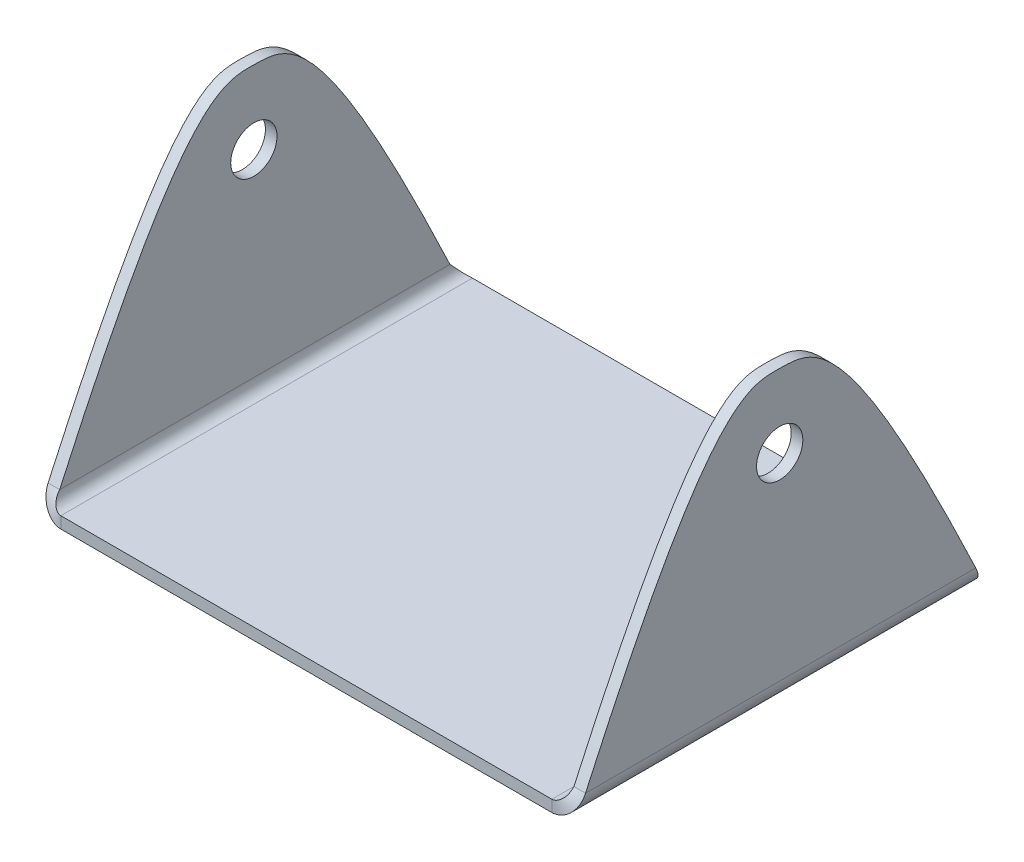
ISO-10303-21;
HEADER;
FILE_DESCRIPTION(('STEP AP214'),'2;1');
FILE_NAME('part.step','',(''),(''),'','','');
FILE_SCHEMA(('AUTOMOTIVE_DESIGN { 1 0 10303 214 1 1 1 1 }'));
ENDSEC;
DATA;
#1=APPLICATION_CONTEXT('core data for automotive mechanical design processes');
#2=APPLICATION_PROTOCOL_DEFINITION('international standard','automotive_design',2000,#1);
#3=PRODUCT_CONTEXT('',#1,'mechanical');
#4=PRODUCT('Part','Part','',(#3));
#5=PRODUCT_RELATED_PRODUCT_CATEGORY('part','',(#4));
#6=PRODUCT_DEFINITION_FORMATION('','',#4);
#7=PRODUCT_DEFINITION_CONTEXT('part definition',#1,'design');
#8=PRODUCT_DEFINITION('design','',#6,#7);
#9=PRODUCT_DEFINITION_SHAPE('','',#8);
#10=(LENGTH_UNIT() NAMED_UNIT(*) SI_UNIT(.MILLI.,.METRE.));
#11=(NAMED_UNIT(*) PLANE_ANGLE_UNIT() SI_UNIT($,.RADIAN.));
#12=(NAMED_UNIT(*) SI_UNIT($,.STERADIAN.) SOLID_ANGLE_UNIT());
#13=UNCERTAINTY_MEASURE_WITH_UNIT(LENGTH_MEASURE(1.E-05),#10,'distance_accuracy_value','');
#14=(GEOMETRIC_REPRESENTATION_CONTEXT(3) GLOBAL_UNCERTAINTY_ASSIGNED_CONTEXT((#13)) GLOBAL_UNIT_ASSIGNED_CONTEXT((#10,
#11,#12)) REPRESENTATION_CONTEXT('',''));
#15=CARTESIAN_POINT('',(0.,0.,0.));
#16=DIRECTION('',(0.,0.,1.));
#17=DIRECTION('',(1.,0.,0.));
#18=AXIS2_PLACEMENT_3D('',#15,#16,#17);
#19=CARTESIAN_POINT('',(53.3958814357847,-1.32135485592361,-40.9040584229734));
#20=DIRECTION('',(0.,0.,-1.));
#21=DIRECTION('',(-1.,0.,0.));
#22=AXIS2_PLACEMENT_3D('',#19,#20,#21);
#23=PLANE('',#22);
#24=CARTESIAN_POINT('',(-4.36467848101533,-0.0213548143236099,-40.9040584229734));
#25=CARTESIAN_POINT('',(-4.36467848101533,-1.32135485592361,-40.9040584229734));
#26=B_SPLINE_CURVE_WITH_KNOTS('',1,(#24,#25),.UNSPECIFIED.,.F.,.F.,(2,2),(0.,1.),.UNSPECIFIED.);
#27=CARTESIAN_POINT('',(-4.36467848101533,-0.0213548143236099,-40.9040584229734));
#28=VERTEX_POINT('',#27);
#29=CARTESIAN_POINT('',(-4.36467848101533,-1.32135485592361,-40.9040584229734));
#30=VERTEX_POINT('',#29);
#31=EDGE_CURVE('E11',#28,#30,#26,.T.);
#32=ORIENTED_EDGE('',*,*,#31,.F.);
#33=DIRECTION('',(1.,0.,0.));
#34=VECTOR('',#33,1.);
#35=CARTESIAN_POINT('',(53.3958814357847,-0.0213548143236099,-40.9040584229734));
#36=LINE('',#35,#34);
#37=CARTESIAN_POINT('',(50.7958813525847,-0.0213548143236099,-40.9040584229734));
#38=VERTEX_POINT('',#37);
#39=EDGE_CURVE('E89',#38,#28,#36,.F.);
#40=ORIENTED_EDGE('',*,*,#39,.F.);
#41=CARTESIAN_POINT('',(50.7958813525847,-1.32135485592361,-40.9040584229734));
#42=CARTESIAN_POINT('',(50.7958813525847,-0.0213548143236083,-40.9040584229734));
#43=B_SPLINE_CURVE_WITH_KNOTS('',1,(#41,#42),.UNSPECIFIED.,.F.,.F.,(2,2),(0.,1.),.UNSPECIFIED.);
#44=CARTESIAN_POINT('',(50.7958813525847,-1.32135485592361,-40.9040584229734));
#45=VERTEX_POINT('',#44);
#46=EDGE_CURVE('E52',#38,#45,#43,.F.);
#47=ORIENTED_EDGE('',*,*,#46,.T.);
#48=DIRECTION('',(-1.,0.,0.));
#49=VECTOR('',#48,1.);
#50=CARTESIAN_POINT('',(53.3958814357847,-1.32135485592361,-40.9040584229734));
#51=LINE('',#50,#49);
#52=EDGE_CURVE('E90',#45,#30,#51,.T.);
#53=ORIENTED_EDGE('',*,*,#52,.T.);
#54=EDGE_LOOP('',(#32,#40,#47,#53));
#55=FACE_BOUND('',#54,.T.);
#56=ADVANCED_FACE('F41',(#55),#23,.T.);
#57=CARTESIAN_POINT('',(53.3958814357847,1.27864522727639,-39.6815680245585));
#58=CARTESIAN_POINT('',(53.3958814357847,0.987146737130774,-39.819573695673));
#59=CARTESIAN_POINT('',(53.3447870874558,0.665094926466159,-39.9652311101939));
#60=CARTESIAN_POINT('',(53.1044211189325,0.0360638158292626,-40.2462624188304));
#61=CARTESIAN_POINT('',(52.914750798196,-0.269809987593072,-40.3818022656543));
#62=CARTESIAN_POINT('',(52.4192520192248,-0.783389922446821,-40.6183390533466));
#63=CARTESIAN_POINT('',(52.1143988455855,-0.989740400718229,-40.7193359942148));
#64=CARTESIAN_POINT('',(51.4633526800292,-1.25878334584269,-40.8621956790282));
#65=CARTESIAN_POINT('',(51.1185354711386,-1.32135485592361,-40.9040584229734));
#66=CARTESIAN_POINT('',(50.7958813525847,-1.32135485592361,-40.9040584229734));
#67=CARTESIAN_POINT('',(52.0958813941847,1.27864522727639,-39.6815680245585));
#68=CARTESIAN_POINT('',(52.0958813941847,1.1328338425608,-39.8196325338721));
#69=CARTESIAN_POINT('',(52.0703342200202,0.971870076871275,-39.9652311101939));
#70=CARTESIAN_POINT('',(51.9501512357586,0.657354521552827,-40.2462624188304));
#71=CARTESIAN_POINT('',(51.8553160753903,0.504417619841661,-40.3818022656543));
#72=CARTESIAN_POINT('',(51.6075666859047,0.247627652414786,-40.6183390533466));
#73=CARTESIAN_POINT('',(51.4551400990851,0.144452413279082,-40.7193359942148));
#74=CARTESIAN_POINT('',(51.1296170163069,0.00993094071684946,-40.8621956790282));
#75=CARTESIAN_POINT('',(50.9572084118616,-0.0213548143236083,-40.9040584229734));
#76=CARTESIAN_POINT('',(50.7958813525847,-0.0213548143236083,-40.9040584229734));
#77=B_SPLINE_SURFACE_WITH_KNOTS('',1,3,((#57,#58,#59,#60,#61,#62,#63,#64,#65,#66),(#67,#68,#69,
#70,#71,#72,#73,#74,#75,#76)),.UNSPECIFIED.,.F.,.F.,.F.,(2,2),(4,2,2,2,4),(0.,1.),(0.,0.25,0.5,
0.75,1.),.UNSPECIFIED.);
#78=CARTESIAN_POINT('',(50.7958813525847,-0.0213548143236083,-40.9040584229734));
#79=CARTESIAN_POINT('',(50.9572084118616,-0.0213548143236083,-40.9040584229734));
#80=CARTESIAN_POINT('',(51.1296170163069,0.00993094071684946,-40.8621956790282));
#81=CARTESIAN_POINT('',(51.4551400990851,0.144452413279082,-40.7193359942148));
#82=CARTESIAN_POINT('',(51.6075666859047,0.247627652414786,-40.6183390533466));
#83=CARTESIAN_POINT('',(51.8553160753903,0.504417619841661,-40.3818022656543));
#84=CARTESIAN_POINT('',(51.9501512357586,0.657354521552827,-40.2462624188304));
#85=CARTESIAN_POINT('',(52.0703342200202,0.971870076871275,-39.9652311101939));
#86=CARTESIAN_POINT('',(52.0958813941847,1.1328338425608,-39.8196325338721));
#87=CARTESIAN_POINT('',(52.0958813941847,1.27864522727639,-39.6815680245585));
#88=B_SPLINE_CURVE_WITH_KNOTS('',3,(#78,#79,#80,#81,#82,#83,#84,#85,#86,#87),.UNSPECIFIED.,.F.,
.F.,(4,2,2,2,4),(0.,0.25,0.5,0.75,1.),.UNSPECIFIED.);
#89=CARTESIAN_POINT('',(52.0958813941847,1.27864522729145,-39.6815680245585));
#90=VERTEX_POINT('',#89);
#91=EDGE_CURVE('E257',#38,#90,#88,.T.);
#92=CARTESIAN_POINT('',(52.0958813941847,1.27864522727639,-39.6815680245585));
#93=CARTESIAN_POINT('',(53.3958814357847,1.27864522727639,-39.6815680245585));
#94=B_SPLINE_CURVE_WITH_KNOTS('',1,(#92,#93),.UNSPECIFIED.,.F.,.F.,(2,2),(0.,1.),.UNSPECIFIED.);
#95=CARTESIAN_POINT('',(53.3958814357847,1.27864522730651,-39.6815680245585));
#96=VERTEX_POINT('',#95);
#97=EDGE_CURVE('E226',#90,#96,#94,.T.);
#98=CARTESIAN_POINT('',(53.3958814357847,1.27864522727639,-39.6815680245585));
#99=CARTESIAN_POINT('',(53.3958814357847,0.987146737130774,-39.819573695673));
#100=CARTESIAN_POINT('',(53.3447870874558,0.665094926466159,-39.9652311101939));
#101=CARTESIAN_POINT('',(53.1044211189325,0.0360638158292626,-40.2462624188304));
#102=CARTESIAN_POINT('',(52.914750798196,-0.269809987593072,-40.3818022656543));
#103=CARTESIAN_POINT('',(52.4192520192248,-0.783389922446821,-40.6183390533466));
#104=CARTESIAN_POINT('',(52.1143988455855,-0.989740400718229,-40.7193359942148));
#105=CARTESIAN_POINT('',(51.4633526800292,-1.25878334584269,-40.8621956790282));
#106=CARTESIAN_POINT('',(51.1185354711386,-1.32135485592361,-40.9040584229734));
#107=CARTESIAN_POINT('',(50.7958813525847,-1.32135485592361,-40.9040584229734));
#108=B_SPLINE_CURVE_WITH_KNOTS('',3,(#98,#99,#100,#101,#102,#103,#104,#105,#106,#107),
.UNSPECIFIED.,.F.,.F.,(4,2,2,2,4),(0.,0.25,0.5,0.75,1.),.UNSPECIFIED.);
#109=EDGE_CURVE('E354',#45,#96,#108,.F.);
#110=ORIENTED_EDGE('',*,*,#46,.F.);
#111=ORIENTED_EDGE('',*,*,#91,.T.);
#112=ORIENTED_EDGE('',*,*,#97,.T.);
#113=ORIENTED_EDGE('',*,*,#109,.F.);
#114=EDGE_LOOP('',(#110,#111,#112,#113));
#115=FACE_BOUND('',#114,.T.);
#116=ADVANCED_FACE('F177',(#115),#77,.F.);
#117=CARTESIAN_POINT('',(53.3958814357847,-1.32135485592361,-40.9040584229734));
#118=CARTESIAN_POINT('',(53.3958814357847,31.8180371755304,-25.4250310798318));
#119=CARTESIAN_POINT('',(53.3958814357847,31.4041925867274,-18.1591387318149));
#120=CARTESIAN_POINT('',(53.3958814357847,32.1638350835329,-9.61260666601467));
#121=CARTESIAN_POINT('',(53.3958814357847,-1.32135485592361,5.32394157702663));
#122=B_SPLINE_CURVE_WITH_KNOTS('',3,(#117,#118,#119,#120,#121),.UNSPECIFIED.,.F.,.F.,(4,1,4),
(0.,0.503093018915711,1.),.UNSPECIFIED.);
#123=DIRECTION('',(-1.,0.,0.));
#124=VECTOR('',#123,1.);
#125=SURFACE_OF_LINEAR_EXTRUSION('',#122,#124);
#126=ORIENTED_EDGE('',*,*,#97,.F.);
#127=CARTESIAN_POINT('',(52.0958813941847,-1.32135485592361,-40.9040584229734));
#128=CARTESIAN_POINT('',(52.0958813941847,31.8180371755304,-25.4250310798318));
#129=CARTESIAN_POINT('',(52.0958813941847,31.4041925867274,-18.1591387318149));
#130=CARTESIAN_POINT('',(52.0958813941847,32.1638350835329,-9.61260666601467));
#131=CARTESIAN_POINT('',(52.0958813941847,-1.32135485592361,5.32394157702663));
#132=B_SPLINE_CURVE_WITH_KNOTS('',3,(#127,#128,#129,#130,#131),.UNSPECIFIED.,.F.,.F.,(4,1,4),
(0.,0.503093018915711,1.),.UNSPECIFIED.);
#133=CARTESIAN_POINT('',(52.0958813941847,1.27864522730694,4.15490016711601));
#134=VERTEX_POINT('',#133);
#135=EDGE_CURVE('E124',#90,#134,#132,.T.);
#136=ORIENTED_EDGE('',*,*,#135,.T.);
#137=CARTESIAN_POINT('',(52.0958813941846,1.27864522773038,4.15490016692404));
#138=DIRECTION('',(1.,9.70027312665172E-12,-4.39752387088034E-12));
#139=VECTOR('',#138,1.);
#140=LINE('',#137,#139);
#141=CARTESIAN_POINT('',(53.3958814357847,1.27864522730695,4.15490016711601));
#142=VERTEX_POINT('',#141);
#143=EDGE_CURVE('E251',#134,#142,#140,.T.);
#144=ORIENTED_EDGE('',*,*,#143,.T.);
#145=EDGE_CURVE('E246',#96,#142,#122,.T.);
#146=ORIENTED_EDGE('',*,*,#145,.F.);
#147=EDGE_LOOP('',(#126,#136,#144,#146));
#148=FACE_BOUND('',#147,.T.);
#149=ADVANCED_FACE('F188',(#148),#125,.F.);
#150=CARTESIAN_POINT('',(50.7958813525847,-1.32135485592361,5.32394157702663));
#151=CARTESIAN_POINT('',(51.1171476947658,-1.32135485592361,5.32394157702663));
#152=CARTESIAN_POINT('',(51.4610654455445,-1.2593052369648,5.28406681350772));
#153=CARTESIAN_POINT('',(52.1113602547343,-0.99141593808192,5.14784736065074));
#154=CARTESIAN_POINT('',(52.416367930462,-0.785674000139332,5.05150267131267));
#155=CARTESIAN_POINT('',(52.9127024729477,-0.272631332897155,4.82562296803602));
#156=CARTESIAN_POINT('',(53.1030319480315,0.0333197108689155,4.69608795409745));
#157=CARTESIAN_POINT('',(53.3444297174844,0.663274815529807,4.42710720283845));
#158=CARTESIAN_POINT('',(53.3958814357847,0.986160263262902,4.28750147651959));
#159=CARTESIAN_POINT('',(53.3958814357847,1.27864522727639,4.15490016711601));
#160=CARTESIAN_POINT('',(50.7958813525847,-0.0213548143236083,5.32394157702663));
#161=CARTESIAN_POINT('',(50.9565145236752,-0.0213548143236083,5.32394157702663));
#162=CARTESIAN_POINT('',(51.1284733990646,0.0096699951557975,5.28406681350772));
#163=CARTESIAN_POINT('',(51.4536208036595,0.143614644597236,5.14784736065074));
#164=CARTESIAN_POINT('',(51.6061246415233,0.246485613568529,5.05150267131267));
#165=CARTESIAN_POINT('',(51.8542919127662,0.503006947189618,4.82562296803602));
#166=CARTESIAN_POINT('',(51.9494566503081,0.655982469072653,4.69608795409745));
#167=CARTESIAN_POINT('',(52.0701555350345,0.9709600214031,4.42710720283845));
#168=CARTESIAN_POINT('',(52.0958813941847,1.1323430358755,4.2875556163546));
#169=CARTESIAN_POINT('',(52.0958813941847,1.27864522727639,4.15490016711601));
#170=B_SPLINE_SURFACE_WITH_KNOTS('',1,3,((#150,#151,#152,#153,#154,#155,#156,#157,#158,#159),
(#160,#161,#162,#163,#164,#165,#166,#167,#168,#169)),.UNSPECIFIED.,.F.,.F.,.F.,(2,2),(4,2,2,2,
4),(0.,1.),(0.,0.25,0.5,0.75,1.),.UNSPECIFIED.);
#171=CARTESIAN_POINT('',(52.0958813941847,1.27864522727639,4.15490016711601));
#172=CARTESIAN_POINT('',(52.0958813941847,1.1323430358755,4.2875556163546));
#173=CARTESIAN_POINT('',(52.0701555350345,0.9709600214031,4.42710720283845));
#174=CARTESIAN_POINT('',(51.9494566503081,0.655982469072653,4.69608795409745));
#175=CARTESIAN_POINT('',(51.8542919127662,0.503006947189618,4.82562296803602));
#176=CARTESIAN_POINT('',(51.6061246415233,0.246485613568529,5.05150267131267));
#177=CARTESIAN_POINT('',(51.4536208036595,0.143614644597236,5.14784736065074));
#178=CARTESIAN_POINT('',(51.1284733990646,0.0096699951557975,5.28406681350772));
#179=CARTESIAN_POINT('',(50.9565145236752,-0.0213548143236083,5.32394157702663));
#180=CARTESIAN_POINT('',(50.7958813525847,-0.0213548143236083,5.32394157702663));
#181=B_SPLINE_CURVE_WITH_KNOTS('',3,(#171,#172,#173,#174,#175,#176,#177,#178,#179,#180),
.UNSPECIFIED.,.F.,.F.,(4,2,2,2,4),(0.,0.25,0.5,0.75,1.),.UNSPECIFIED.);
#182=CARTESIAN_POINT('',(50.7958813525847,-0.0213548143236083,5.32394157702663));
#183=VERTEX_POINT('',#182);
#184=EDGE_CURVE('E132',#134,#183,#181,.T.);
#185=CARTESIAN_POINT('',(50.7958813525847,-0.0213548143236083,5.32394157702663));
#186=CARTESIAN_POINT('',(50.7958813525847,-1.32135485592361,5.32394157702663));
#187=B_SPLINE_CURVE_WITH_KNOTS('',1,(#185,#186),.UNSPECIFIED.,.F.,.F.,(2,2),(0.,1.),.UNSPECIFIED.);
#188=CARTESIAN_POINT('',(50.7958813525847,-1.32135485592361,5.32394157702663));
#189=VERTEX_POINT('',#188);
#190=EDGE_CURVE('E270',#183,#189,#187,.T.);
#191=CARTESIAN_POINT('',(50.7958813525847,-1.32135485592361,5.32394157702663));
#192=CARTESIAN_POINT('',(51.1171476947658,-1.32135485592361,5.32394157702663));
#193=CARTESIAN_POINT('',(51.4610654455445,-1.2593052369648,5.28406681350772));
#194=CARTESIAN_POINT('',(52.1113602547343,-0.99141593808192,5.14784736065074));
#195=CARTESIAN_POINT('',(52.416367930462,-0.785674000139332,5.05150267131267));
#196=CARTESIAN_POINT('',(52.9127024729477,-0.272631332897155,4.82562296803602));
#197=CARTESIAN_POINT('',(53.1030319480315,0.0333197108689155,4.69608795409745));
#198=CARTESIAN_POINT('',(53.3444297174844,0.663274815529807,4.42710720283845));
#199=CARTESIAN_POINT('',(53.3958814357847,0.986160263262902,4.28750147651959));
#200=CARTESIAN_POINT('',(53.3958814357847,1.27864522727639,4.15490016711601));
#201=B_SPLINE_CURVE_WITH_KNOTS('',3,(#191,#192,#193,#194,#195,#196,#197,#198,#199,#200),
.UNSPECIFIED.,.F.,.F.,(4,2,2,2,4),(0.,0.25,0.5,0.75,1.),.UNSPECIFIED.);
#202=EDGE_CURVE('E349',#142,#189,#201,.F.);
#203=ORIENTED_EDGE('',*,*,#143,.F.);
#204=ORIENTED_EDGE('',*,*,#184,.T.);
#205=ORIENTED_EDGE('',*,*,#190,.T.);
#206=ORIENTED_EDGE('',*,*,#202,.F.);
#207=EDGE_LOOP('',(#203,#204,#205,#206));
#208=FACE_BOUND('',#207,.T.);
#209=ADVANCED_FACE('F268',(#208),#170,.F.);
#210=CARTESIAN_POINT('',(53.3958814357847,-1.32135485592361,5.32394157702663));
#211=DIRECTION('',(0.,0.,-1.));
#212=DIRECTION('',(-1.,0.,0.));
#213=AXIS2_PLACEMENT_3D('',#210,#211,#212);
#214=PLANE('',#213);
#215=ORIENTED_EDGE('',*,*,#190,.F.);
#216=DIRECTION('',(1.,0.,0.));
#217=VECTOR('',#216,1.);
#218=CARTESIAN_POINT('',(53.3958814357847,-0.0213548143236099,5.32394157702663));
#219=LINE('',#218,#217);
#220=CARTESIAN_POINT('',(-4.36467848101533,-0.0213548143236099,5.32394157702663));
#221=VERTEX_POINT('',#220);
#222=EDGE_CURVE('E123',#183,#221,#219,.F.);
#223=ORIENTED_EDGE('',*,*,#222,.T.);
#224=CARTESIAN_POINT('',(-4.36467848101533,-1.32135485592361,5.32394157702663));
#225=CARTESIAN_POINT('',(-4.36467848101533,-0.0213548143236099,5.32394157702663));
#226=B_SPLINE_CURVE_WITH_KNOTS('',1,(#224,#225),.UNSPECIFIED.,.F.,.F.,(2,2),(0.,1.),.UNSPECIFIED.);
#227=CARTESIAN_POINT('',(-4.36467848101533,-1.32135485592361,5.32394157702663));
#228=VERTEX_POINT('',#227);
#229=EDGE_CURVE('E492',#221,#228,#226,.F.);
#230=ORIENTED_EDGE('',*,*,#229,.T.);
#231=DIRECTION('',(-1.,0.,0.));
#232=VECTOR('',#231,1.);
#233=CARTESIAN_POINT('',(53.3958814357847,-1.32135485592361,5.32394157702663));
#234=LINE('',#233,#232);
#235=EDGE_CURVE('E403',#189,#228,#234,.T.);
#236=ORIENTED_EDGE('',*,*,#235,.F.);
#237=EDGE_LOOP('',(#215,#223,#230,#236));
#238=FACE_BOUND('',#237,.T.);
#239=ADVANCED_FACE('F296',(#238),#214,.F.);
#240=CARTESIAN_POINT('',(-6.96467856421533,1.27864522727639,4.15490016711601));
#241=CARTESIAN_POINT('',(-6.96467856421533,0.9861602632629,4.28750147651959));
#242=CARTESIAN_POINT('',(-6.91322684591506,0.663274815529806,4.42710720283845));
#243=CARTESIAN_POINT('',(-6.67182907646217,0.0333197108689138,4.69608795409745));
#244=CARTESIAN_POINT('',(-6.48149960137836,-0.272631332897155,4.82562296803602));
#245=CARTESIAN_POINT('',(-5.98516505889267,-0.785674000139334,5.05150267131267));
#246=CARTESIAN_POINT('',(-5.68015738316499,-0.99141593808192,5.14784736065074));
#247=CARTESIAN_POINT('',(-5.02986257397513,-1.2593052369648,5.28406681350772));
#248=CARTESIAN_POINT('',(-4.68594482319644,-1.32135485592361,5.32394157702663));
#249=CARTESIAN_POINT('',(-4.36467848101533,-1.32135485592361,5.32394157702663));
#250=CARTESIAN_POINT('',(-5.66467852261533,1.27864522727639,4.15490016711601));
#251=CARTESIAN_POINT('',(-5.66467852261533,1.1323430358755,4.2875556163546));
#252=CARTESIAN_POINT('',(-5.6389526634652,0.970960021403098,4.42710720283845));
#253=CARTESIAN_POINT('',(-5.51825377873875,0.655982469072652,4.69608795409745));
#254=CARTESIAN_POINT('',(-5.42308904119684,0.503006947189618,4.82562296803602));
#255=CARTESIAN_POINT('',(-5.174921769954,0.246485613568528,5.05150267131267));
#256=CARTESIAN_POINT('',(-5.02241793209016,0.143614644597235,5.14784736065074));
#257=CARTESIAN_POINT('',(-4.69727052749523,0.00966999515579637,5.28406681350772));
#258=CARTESIAN_POINT('',(-4.52531165210588,-0.0213548143236099,5.32394157702663));
#259=CARTESIAN_POINT('',(-4.36467848101533,-0.0213548143236099,5.32394157702663));
#260=B_SPLINE_SURFACE_WITH_KNOTS('',1,3,((#240,#241,#242,#243,#244,#245,#246,#247,#248,#249),
(#250,#251,#252,#253,#254,#255,#256,#257,#258,#259)),.UNSPECIFIED.,.F.,.F.,.F.,(2,2),(4,2,2,2,
4),(0.,1.),(0.,0.25,0.5,0.75,1.),.UNSPECIFIED.);
#261=CARTESIAN_POINT('',(-4.36467848101533,-0.0213548143236099,5.32394157702663));
#262=CARTESIAN_POINT('',(-4.52531165210588,-0.0213548143236099,5.32394157702663));
#263=CARTESIAN_POINT('',(-4.69727052749523,0.00966999515579637,5.28406681350772));
#264=CARTESIAN_POINT('',(-5.02241793209016,0.143614644597235,5.14784736065074));
#265=CARTESIAN_POINT('',(-5.174921769954,0.246485613568528,5.05150267131267));
#266=CARTESIAN_POINT('',(-5.42308904119684,0.503006947189618,4.82562296803602));
#267=CARTESIAN_POINT('',(-5.51825377873875,0.655982469072652,4.69608795409745));
#268=CARTESIAN_POINT('',(-5.6389526634652,0.970960021403098,4.42710720283845));
#269=CARTESIAN_POINT('',(-5.66467852261533,1.1323430358755,4.2875556163546));
#270=CARTESIAN_POINT('',(-5.66467852261533,1.27864522727639,4.15490016711601));
#271=B_SPLINE_CURVE_WITH_KNOTS('',3,(#261,#262,#263,#264,#265,#266,#267,#268,#269,#270),
.UNSPECIFIED.,.F.,.F.,(4,2,2,2,4),(0.,0.25,0.5,0.75,1.),.UNSPECIFIED.);
#272=CARTESIAN_POINT('',(-5.66467852261533,1.27864522729167,4.15490016711601));
#273=VERTEX_POINT('',#272);
#274=EDGE_CURVE('E110',#221,#273,#271,.T.);
#275=CARTESIAN_POINT('',(-5.66467852261533,1.27864522727639,4.15490016711601));
#276=CARTESIAN_POINT('',(-6.96467856421533,1.27864522727639,4.15490016711601));
#277=B_SPLINE_CURVE_WITH_KNOTS('',1,(#275,#276),.UNSPECIFIED.,.F.,.F.,(2,2),(0.,1.),.UNSPECIFIED.);
#278=CARTESIAN_POINT('',(-6.96467856421533,1.27864522730695,4.15490016711601));
#279=VERTEX_POINT('',#278);
#280=EDGE_CURVE('E481',#273,#279,#277,.T.);
#281=CARTESIAN_POINT('',(-6.96467856421533,1.27864522727639,4.15490016711601));
#282=CARTESIAN_POINT('',(-6.96467856421533,0.9861602632629,4.28750147651959));
#283=CARTESIAN_POINT('',(-6.91322684591506,0.663274815529806,4.42710720283845));
#284=CARTESIAN_POINT('',(-6.67182907646217,0.0333197108689138,4.69608795409745));
#285=CARTESIAN_POINT('',(-6.48149960137836,-0.272631332897155,4.82562296803602));
#286=CARTESIAN_POINT('',(-5.98516505889267,-0.785674000139334,5.05150267131267));
#287=CARTESIAN_POINT('',(-5.68015738316499,-0.99141593808192,5.14784736065074));
#288=CARTESIAN_POINT('',(-5.02986257397513,-1.2593052369648,5.28406681350772));
#289=CARTESIAN_POINT('',(-4.68594482319644,-1.32135485592361,5.32394157702663));
#290=CARTESIAN_POINT('',(-4.36467848101533,-1.32135485592361,5.32394157702663));
#291=B_SPLINE_CURVE_WITH_KNOTS('',3,(#281,#282,#283,#284,#285,#286,#287,#288,#289,#290),
.UNSPECIFIED.,.F.,.F.,(4,2,2,2,4),(0.,0.25,0.5,0.75,1.),.UNSPECIFIED.);
#292=EDGE_CURVE('E439',#228,#279,#291,.F.);
#293=ORIENTED_EDGE('',*,*,#229,.F.);
#294=ORIENTED_EDGE('',*,*,#274,.T.);
#295=ORIENTED_EDGE('',*,*,#280,.T.);
#296=ORIENTED_EDGE('',*,*,#292,.F.);
#297=EDGE_LOOP('',(#293,#294,#295,#296));
#298=FACE_BOUND('',#297,.T.);
#299=ADVANCED_FACE('F444',(#298),#260,.F.);
#300=CARTESIAN_POINT('',(-6.96467856421533,-1.32135485592361,-40.9040584229734));
#301=CARTESIAN_POINT('',(-6.96467856421533,31.8180371755304,-25.4250310798318));
#302=CARTESIAN_POINT('',(-6.96467856421533,31.4041925867274,-18.1591387318149));
#303=CARTESIAN_POINT('',(-6.96467856421533,32.1638350835329,-9.61260666601467));
#304=CARTESIAN_POINT('',(-6.96467856421533,-1.32135485592361,5.32394157702663));
#305=B_SPLINE_CURVE_WITH_KNOTS('',3,(#300,#301,#302,#303,#304),.UNSPECIFIED.,.F.,.F.,(4,1,4),
(0.,0.503093018915711,1.),.UNSPECIFIED.);
#306=DIRECTION('',(-1.,0.,0.));
#307=VECTOR('',#306,1.);
#308=SURFACE_OF_LINEAR_EXTRUSION('',#305,#307);
#309=ORIENTED_EDGE('',*,*,#280,.F.);
#310=CARTESIAN_POINT('',(-5.66467852261533,-1.32135485592361,-40.9040584229734));
#311=CARTESIAN_POINT('',(-5.66467852261533,31.8180371755304,-25.4250310798318));
#312=CARTESIAN_POINT('',(-5.66467852261533,31.4041925867274,-18.1591387318149));
#313=CARTESIAN_POINT('',(-5.66467852261533,32.1638350835329,-9.61260666601467));
#314=CARTESIAN_POINT('',(-5.66467852261533,-1.32135485592361,5.32394157702663));
#315=B_SPLINE_CURVE_WITH_KNOTS('',3,(#310,#311,#312,#313,#314),.UNSPECIFIED.,.F.,.F.,(4,1,4),
(0.,0.503093018915711,1.),.UNSPECIFIED.);
#316=CARTESIAN_POINT('',(-5.66467852261533,1.27864522730651,-39.6815680245585));
#317=VERTEX_POINT('',#316);
#318=EDGE_CURVE('E116',#317,#273,#315,.T.);
#319=ORIENTED_EDGE('',*,*,#318,.F.);
#320=CARTESIAN_POINT('',(-5.66467852261533,1.27864522782091,-39.681568024315));
#321=DIRECTION('',(-1.,9.46291625864016E-12,4.49426806163718E-12));
#322=VECTOR('',#321,1.);
#323=LINE('',#320,#322);
#324=CARTESIAN_POINT('',(-6.96467856421533,1.27864522730651,-39.6815680245585));
#325=VERTEX_POINT('',#324);
#326=EDGE_CURVE('E130',#317,#325,#323,.T.);
#327=ORIENTED_EDGE('',*,*,#326,.T.);
#328=EDGE_CURVE('E411',#325,#279,#305,.T.);
#329=ORIENTED_EDGE('',*,*,#328,.T.);
#330=EDGE_LOOP('',(#309,#319,#327,#329));
#331=FACE_BOUND('',#330,.T.);
#332=ADVANCED_FACE('F455',(#331),#308,.F.);
#333=CARTESIAN_POINT('',(53.3958814357847,23.4567679524764,-17.6583100864655));
#334=DIRECTION('',(-1.,0.,0.));
#335=DIRECTION('',(0.,0.,1.));
#336=AXIS2_PLACEMENT_3D('',#333,#334,#335);
#337=CYLINDRICAL_SURFACE('',#336,2.6);
#338=CARTESIAN_POINT('',(53.3958814357847,23.4567679524764,-17.6583100864655));
#339=DIRECTION('',(1.,0.,0.));
#340=DIRECTION('',(0.,0.,-1.));
#341=AXIS2_PLACEMENT_3D('',#338,#339,#340);
#342=CIRCLE('',#341,2.6);
#343=CARTESIAN_POINT('',(53.3958814357847,23.4567679524764,-20.2583100864655));
#344=VERTEX_POINT('',#343);
#345=EDGE_CURVE('E347',#344,#344,#342,.T.);
#346=ORIENTED_EDGE('',*,*,#345,.T.);
#347=EDGE_LOOP('',(#346));
#348=FACE_BOUND('',#347,.T.);
#349=CARTESIAN_POINT('',(52.0958813941847,23.4567679524764,-17.6583100864655));
#350=DIRECTION('',(1.,0.,0.));
#351=DIRECTION('',(0.,0.,-1.));
#352=AXIS2_PLACEMENT_3D('',#349,#350,#351);
#353=CIRCLE('',#352,2.6);
#354=CARTESIAN_POINT('',(52.0958813941847,23.4567679524764,-20.2583100864655));
#355=VERTEX_POINT('',#354);
#356=EDGE_CURVE('E264',#355,#355,#353,.T.);
#357=ORIENTED_EDGE('',*,*,#356,.F.);
#358=EDGE_LOOP('',(#357));
#359=FACE_BOUND('',#358,.T.);
#360=ADVANCED_FACE('F43',(#348,#359),#337,.F.);
#361=CARTESIAN_POINT('',(-6.96467856421533,23.4567679524764,-17.6583100864655));
#362=DIRECTION('',(-1.,0.,0.));
#363=DIRECTION('',(0.,0.,1.));
#364=AXIS2_PLACEMENT_3D('',#361,#362,#363);
#365=CYLINDRICAL_SURFACE('',#364,2.6);
#366=CARTESIAN_POINT('',(-6.96467856421533,23.4567679524764,-17.6583100864655));
#367=DIRECTION('',(-1.,0.,0.));
#368=DIRECTION('',(0.,0.,1.));
#369=AXIS2_PLACEMENT_3D('',#366,#367,#368);
#370=CIRCLE('',#369,2.6);
#371=CARTESIAN_POINT('',(-6.96467856421533,23.4567679524764,-15.0583100864655));
#372=VERTEX_POINT('',#371);
#373=EDGE_CURVE('E407',#372,#372,#370,.T.);
#374=ORIENTED_EDGE('',*,*,#373,.T.);
#375=EDGE_LOOP('',(#374));
#376=FACE_BOUND('',#375,.T.);
#377=CARTESIAN_POINT('',(-5.66467852261533,23.4567679524764,-17.6583100864655));
#378=DIRECTION('',(-1.,0.,0.));
#379=DIRECTION('',(0.,0.,1.));
#380=AXIS2_PLACEMENT_3D('',#377,#378,#379);
#381=CIRCLE('',#380,2.6);
#382=CARTESIAN_POINT('',(-5.66467852261533,23.4567679524764,-15.0583100864655));
#383=VERTEX_POINT('',#382);
#384=EDGE_CURVE('E434',#383,#383,#381,.T.);
#385=ORIENTED_EDGE('',*,*,#384,.F.);
#386=EDGE_LOOP('',(#385));
#387=FACE_BOUND('',#386,.T.);
#388=ADVANCED_FACE('F154',(#376,#387),#365,.F.);
#389=CARTESIAN_POINT('',(-4.36467848101533,-1.32135485592361,-40.9040584229734));
#390=CARTESIAN_POINT('',(-4.68733259956921,-1.32135485592361,-40.9040584229734));
#391=CARTESIAN_POINT('',(-5.03214980845984,-1.2587833458427,-40.8621956790282));
#392=CARTESIAN_POINT('',(-5.68319597401614,-0.989740400718231,-40.7193359942148));
#393=CARTESIAN_POINT('',(-5.98804914765544,-0.783389922446823,-40.6183390533466));
#394=CARTESIAN_POINT('',(-6.48354792662663,-0.269809987593074,-40.3818022656543));
#395=CARTESIAN_POINT('',(-6.67321824736317,0.0360638158292609,-40.2462624188303));
#396=CARTESIAN_POINT('',(-6.91358421588647,0.665094926466157,-39.9652311101939));
#397=CARTESIAN_POINT('',(-6.96467856421533,0.987146737130772,-39.819573695673));
#398=CARTESIAN_POINT('',(-6.96467856421533,1.27864522727639,-39.6815680245585));
#399=CARTESIAN_POINT('',(-4.36467848101533,-0.0213548143236099,-40.9040584229734));
#400=CARTESIAN_POINT('',(-4.52600554029227,-0.0213548143236099,-40.9040584229734));
#401=CARTESIAN_POINT('',(-4.69841414473759,0.0099309407168472,-40.8621956790282));
#402=CARTESIAN_POINT('',(-5.02393722751573,0.14445241327908,-40.7193359942148));
#403=CARTESIAN_POINT('',(-5.17636381433538,0.247627652414784,-40.6183390533466));
#404=CARTESIAN_POINT('',(-5.42411320382098,0.504417619841658,-40.3818022656543));
#405=CARTESIAN_POINT('',(-5.51894836418925,0.657354521552826,-40.2462624188303));
#406=CARTESIAN_POINT('',(-5.6391313484509,0.971870076871274,-39.9652311101939));
#407=CARTESIAN_POINT('',(-5.66467852261533,1.1328338425608,-39.8196325338721));
#408=CARTESIAN_POINT('',(-5.66467852261533,1.27864522727639,-39.6815680245585));
#409=B_SPLINE_SURFACE_WITH_KNOTS('',1,3,((#389,#390,#391,#392,#393,#394,#395,#396,#397,#398),
(#399,#400,#401,#402,#403,#404,#405,#406,#407,#408)),.UNSPECIFIED.,.F.,.F.,.F.,(2,2),(4,2,2,2,
4),(0.,1.),(0.,0.25,0.5,0.75,1.),.UNSPECIFIED.);
#410=CARTESIAN_POINT('',(-5.66467852261533,1.27864522727639,-39.6815680245585));
#411=CARTESIAN_POINT('',(-5.66467852261533,1.1328338425608,-39.8196325338721));
#412=CARTESIAN_POINT('',(-5.6391313484509,0.971870076871274,-39.9652311101939));
#413=CARTESIAN_POINT('',(-5.51894836418925,0.657354521552826,-40.2462624188303));
#414=CARTESIAN_POINT('',(-5.42411320382098,0.504417619841658,-40.3818022656543));
#415=CARTESIAN_POINT('',(-5.17636381433538,0.247627652414784,-40.6183390533466));
#416=CARTESIAN_POINT('',(-5.02393722751573,0.14445241327908,-40.7193359942148));
#417=CARTESIAN_POINT('',(-4.69841414473759,0.0099309407168472,-40.8621956790282));
#418=CARTESIAN_POINT('',(-4.52600554029227,-0.0213548143236099,-40.9040584229734));
#419=CARTESIAN_POINT('',(-4.36467848101533,-0.0213548143236099,-40.9040584229734));
#420=B_SPLINE_CURVE_WITH_KNOTS('',3,(#410,#411,#412,#413,#414,#415,#416,#417,#418,#419),
.UNSPECIFIED.,.F.,.F.,(4,2,2,2,4),(0.,0.25,0.5,0.75,1.),.UNSPECIFIED.);
#421=EDGE_CURVE('E106',#317,#28,#420,.T.);
#422=CARTESIAN_POINT('',(-4.36467848101533,-1.32135485592361,-40.9040584229734));
#423=CARTESIAN_POINT('',(-4.68733259956921,-1.32135485592361,-40.9040584229734));
#424=CARTESIAN_POINT('',(-5.03214980845984,-1.2587833458427,-40.8621956790282));
#425=CARTESIAN_POINT('',(-5.68319597401614,-0.989740400718231,-40.7193359942148));
#426=CARTESIAN_POINT('',(-5.98804914765544,-0.783389922446823,-40.6183390533466));
#427=CARTESIAN_POINT('',(-6.48354792662663,-0.269809987593074,-40.3818022656543));
#428=CARTESIAN_POINT('',(-6.67321824736317,0.0360638158292609,-40.2462624188303));
#429=CARTESIAN_POINT('',(-6.91358421588647,0.665094926466157,-39.9652311101939));
#430=CARTESIAN_POINT('',(-6.96467856421533,0.987146737130772,-39.819573695673));
#431=CARTESIAN_POINT('',(-6.96467856421533,1.27864522727639,-39.6815680245585));
#432=B_SPLINE_CURVE_WITH_KNOTS('',3,(#422,#423,#424,#425,#426,#427,#428,#429,#430,#431),
.UNSPECIFIED.,.F.,.F.,(4,2,2,2,4),(0.,0.25,0.5,0.75,1.),.UNSPECIFIED.);
#433=EDGE_CURVE('E353',#325,#30,#432,.F.);
#434=ORIENTED_EDGE('',*,*,#421,.T.);
#435=ORIENTED_EDGE('',*,*,#31,.T.);
#436=ORIENTED_EDGE('',*,*,#433,.F.);
#437=ORIENTED_EDGE('',*,*,#326,.F.);
#438=EDGE_LOOP('',(#434,#435,#436,#437));
#439=FACE_BOUND('',#438,.T.);
#440=ADVANCED_FACE('F128',(#439),#409,.F.);
#441=CARTESIAN_POINT('',(-6.96467856421533,31.697032986463,-17.8634234376149));
#442=DIRECTION('',(-1.,0.,0.));
#443=DIRECTION('',(0.,0.,1.));
#444=AXIS2_PLACEMENT_3D('',#441,#442,#443);
#445=PLANE('',#444);
#446=ORIENTED_EDGE('',*,*,#373,.F.);
#447=EDGE_LOOP('',(#446));
#448=FACE_BOUND('',#447,.T.);
#449=ORIENTED_EDGE('',*,*,#328,.F.);
#450=DIRECTION('',(0.,0.,-1.));
#451=VECTOR('',#450,1.);
#452=CARTESIAN_POINT('',(-6.96467856421533,1.27864522727639,5.32394157702663));
#453=LINE('',#452,#451);
#454=EDGE_CURVE('E358',#325,#279,#453,.F.);
#455=ORIENTED_EDGE('',*,*,#454,.T.);
#456=EDGE_LOOP('',(#449,#455));
#457=FACE_BOUND('',#456,.T.);
#458=ADVANCED_FACE('F153',(#448,#457),#445,.T.);
#459=CARTESIAN_POINT('',(53.3958814357847,-1.32135485592361,5.32394157702663));
#460=DIRECTION('',(0.,1.,0.));
#461=DIRECTION('',(0.,0.,1.));
#462=AXIS2_PLACEMENT_3D('',#459,#460,#461);
#463=PLANE('',#462);
#464=ORIENTED_EDGE('',*,*,#52,.F.);
#465=DIRECTION('',(0.,0.,-1.));
#466=VECTOR('',#465,1.);
#467=CARTESIAN_POINT('',(50.7958813525847,-1.32135485592361,5.32394157702663));
#468=LINE('',#467,#466);
#469=EDGE_CURVE('E357',#45,#189,#468,.F.);
#470=ORIENTED_EDGE('',*,*,#469,.T.);
#471=ORIENTED_EDGE('',*,*,#235,.T.);
#472=DIRECTION('',(0.,0.,-1.));
#473=VECTOR('',#472,1.);
#474=CARTESIAN_POINT('',(-4.36467848101533,-1.32135485592361,-40.9040584229734));
#475=LINE('',#474,#473);
#476=EDGE_CURVE('E363',#228,#30,#475,.T.);
#477=ORIENTED_EDGE('',*,*,#476,.T.);
#478=EDGE_LOOP('',(#464,#470,#471,#477));
#479=FACE_BOUND('',#478,.T.);
#480=ADVANCED_FACE('F401',(#479),#463,.F.);
#481=CARTESIAN_POINT('',(53.3958814357847,31.697032986463,-17.8634234376149));
#482=DIRECTION('',(-1.,0.,0.));
#483=DIRECTION('',(0.,0.,1.));
#484=AXIS2_PLACEMENT_3D('',#481,#482,#483);
#485=PLANE('',#484);
#486=ORIENTED_EDGE('',*,*,#345,.F.);
#487=EDGE_LOOP('',(#486));
#488=FACE_BOUND('',#487,.T.);
#489=ORIENTED_EDGE('',*,*,#145,.T.);
#490=DIRECTION('',(0.,0.,-1.));
#491=VECTOR('',#490,1.);
#492=CARTESIAN_POINT('',(53.3958814357847,1.27864522727639,-17.8634234376149));
#493=LINE('',#492,#491);
#494=EDGE_CURVE('E346',#142,#96,#493,.T.);
#495=ORIENTED_EDGE('',*,*,#494,.T.);
#496=EDGE_LOOP('',(#489,#495));
#497=FACE_BOUND('',#496,.T.);
#498=ADVANCED_FACE('F344',(#488,#497),#485,.F.);
#499=CARTESIAN_POINT('',(-4.36467848101533,1.27864522727639,5.32394157702663));
#500=DIRECTION('',(0.,0.,1.));
#501=DIRECTION('',(1.,0.,0.));
#502=AXIS2_PLACEMENT_3D('',#499,#500,#501);
#503=CYLINDRICAL_SURFACE('',#502,2.6000000832);
#504=ORIENTED_EDGE('',*,*,#292,.T.);
#505=ORIENTED_EDGE('',*,*,#454,.F.);
#506=ORIENTED_EDGE('',*,*,#433,.T.);
#507=ORIENTED_EDGE('',*,*,#476,.F.);
#508=EDGE_LOOP('',(#504,#505,#506,#507));
#509=FACE_BOUND('',#508,.T.);
#510=ADVANCED_FACE('F521',(#509),#503,.T.);
#511=CARTESIAN_POINT('',(50.7958813525847,1.27864522727639,-17.8634234376149));
#512=DIRECTION('',(0.,0.,-1.));
#513=DIRECTION('',(-1.,0.,0.));
#514=AXIS2_PLACEMENT_3D('',#511,#512,#513);
#515=CYLINDRICAL_SURFACE('',#514,2.6000000832);
#516=ORIENTED_EDGE('',*,*,#202,.T.);
#517=ORIENTED_EDGE('',*,*,#469,.F.);
#518=ORIENTED_EDGE('',*,*,#109,.T.);
#519=ORIENTED_EDGE('',*,*,#494,.F.);
#520=EDGE_LOOP('',(#516,#517,#518,#519));
#521=FACE_BOUND('',#520,.T.);
#522=ADVANCED_FACE('F356',(#521),#515,.T.);
#523=CARTESIAN_POINT('',(-5.66467852261533,31.697032986463,-17.8634234376149));
#524=DIRECTION('',(-1.,0.,0.));
#525=DIRECTION('',(0.,0.,1.));
#526=AXIS2_PLACEMENT_3D('',#523,#524,#525);
#527=PLANE('',#526);
#528=ORIENTED_EDGE('',*,*,#384,.T.);
#529=EDGE_LOOP('',(#528));
#530=FACE_BOUND('',#529,.T.);
#531=ORIENTED_EDGE('',*,*,#318,.T.);
#532=DIRECTION('',(0.,0.,1.));
#533=VECTOR('',#532,1.);
#534=CARTESIAN_POINT('',(-5.66467852261533,1.27864522730651,-17.8634234376149));
#535=LINE('',#534,#533);
#536=EDGE_CURVE('E115',#317,#273,#535,.T.);
#537=ORIENTED_EDGE('',*,*,#536,.F.);
#538=EDGE_LOOP('',(#531,#537));
#539=FACE_BOUND('',#538,.T.);
#540=ADVANCED_FACE('F385',(#530,#539),#527,.F.);
#541=CARTESIAN_POINT('',(53.3958814357847,-0.0213548143236099,5.32394157702663));
#542=DIRECTION('',(0.,1.,0.));
#543=DIRECTION('',(0.,0.,1.));
#544=AXIS2_PLACEMENT_3D('',#541,#542,#543);
#545=PLANE('',#544);
#546=ORIENTED_EDGE('',*,*,#39,.T.);
#547=DIRECTION('',(0.,0.,1.));
#548=VECTOR('',#547,1.);
#549=CARTESIAN_POINT('',(-4.36467848101533,-0.0213548143236099,5.32394157702663));
#550=LINE('',#549,#548);
#551=EDGE_CURVE('E103',#221,#28,#550,.F.);
#552=ORIENTED_EDGE('',*,*,#551,.F.);
#553=ORIENTED_EDGE('',*,*,#222,.F.);
#554=DIRECTION('',(0.,0.,1.));
#555=VECTOR('',#554,1.);
#556=CARTESIAN_POINT('',(50.7958813525847,-0.0213548143236099,5.32394157702663));
#557=LINE('',#556,#555);
#558=EDGE_CURVE('E121',#38,#183,#557,.T.);
#559=ORIENTED_EDGE('',*,*,#558,.F.);
#560=EDGE_LOOP('',(#546,#552,#553,#559));
#561=FACE_BOUND('',#560,.T.);
#562=ADVANCED_FACE('F119',(#561),#545,.T.);
#563=CARTESIAN_POINT('',(52.0958813941847,31.697032986463,-17.8634234376149));
#564=DIRECTION('',(-1.,0.,0.));
#565=DIRECTION('',(0.,0.,1.));
#566=AXIS2_PLACEMENT_3D('',#563,#564,#565);
#567=PLANE('',#566);
#568=ORIENTED_EDGE('',*,*,#356,.T.);
#569=EDGE_LOOP('',(#568));
#570=FACE_BOUND('',#569,.T.);
#571=ORIENTED_EDGE('',*,*,#135,.F.);
#572=DIRECTION('',(0.,0.,1.));
#573=VECTOR('',#572,1.);
#574=CARTESIAN_POINT('',(52.0958813941847,1.27864522730694,-17.8634234376149));
#575=LINE('',#574,#573);
#576=EDGE_CURVE('E255',#134,#90,#575,.F.);
#577=ORIENTED_EDGE('',*,*,#576,.F.);
#578=EDGE_LOOP('',(#571,#577));
#579=FACE_BOUND('',#578,.T.);
#580=ADVANCED_FACE('F263',(#570,#579),#567,.T.);
#581=CARTESIAN_POINT('',(-4.36467848101533,1.27864522727639,5.32394157702663));
#582=DIRECTION('',(0.,0.,1.));
#583=DIRECTION('',(1.,0.,0.));
#584=AXIS2_PLACEMENT_3D('',#581,#582,#583);
#585=CYLINDRICAL_SURFACE('',#584,1.3000000416);
#586=ORIENTED_EDGE('',*,*,#274,.F.);
#587=ORIENTED_EDGE('',*,*,#551,.T.);
#588=ORIENTED_EDGE('',*,*,#421,.F.);
#589=ORIENTED_EDGE('',*,*,#536,.T.);
#590=EDGE_LOOP('',(#586,#587,#588,#589));
#591=FACE_BOUND('',#590,.T.);
#592=ADVANCED_FACE('F104',(#591),#585,.F.);
#593=CARTESIAN_POINT('',(50.7958813525847,1.27864522727639,-17.8634234376149));
#594=DIRECTION('',(0.,0.,-1.));
#595=DIRECTION('',(-1.,0.,0.));
#596=AXIS2_PLACEMENT_3D('',#593,#594,#595);
#597=CYLINDRICAL_SURFACE('',#596,1.3000000416);
#598=ORIENTED_EDGE('',*,*,#184,.F.);
#599=ORIENTED_EDGE('',*,*,#576,.T.);
#600=ORIENTED_EDGE('',*,*,#91,.F.);
#601=ORIENTED_EDGE('',*,*,#558,.T.);
#602=EDGE_LOOP('',(#598,#599,#600,#601));
#603=FACE_BOUND('',#602,.T.);
#604=ADVANCED_FACE('F256',(#603),#597,.F.);
#605=CLOSED_SHELL('',(#56,#116,#149,#209,#239,#299,#332,#360,#388,#440,#458,#480,#498,#510,#522,
#540,#562,#580,#592,#604));
#606=MANIFOLD_SOLID_BREP('B2',#605);
#607=ADVANCED_BREP_SHAPE_REPRESENTATION('',(#18,#606),#14);
#608=SHAPE_DEFINITION_REPRESENTATION(#9,#607);
ENDSEC;
END-ISO-10303-21;
